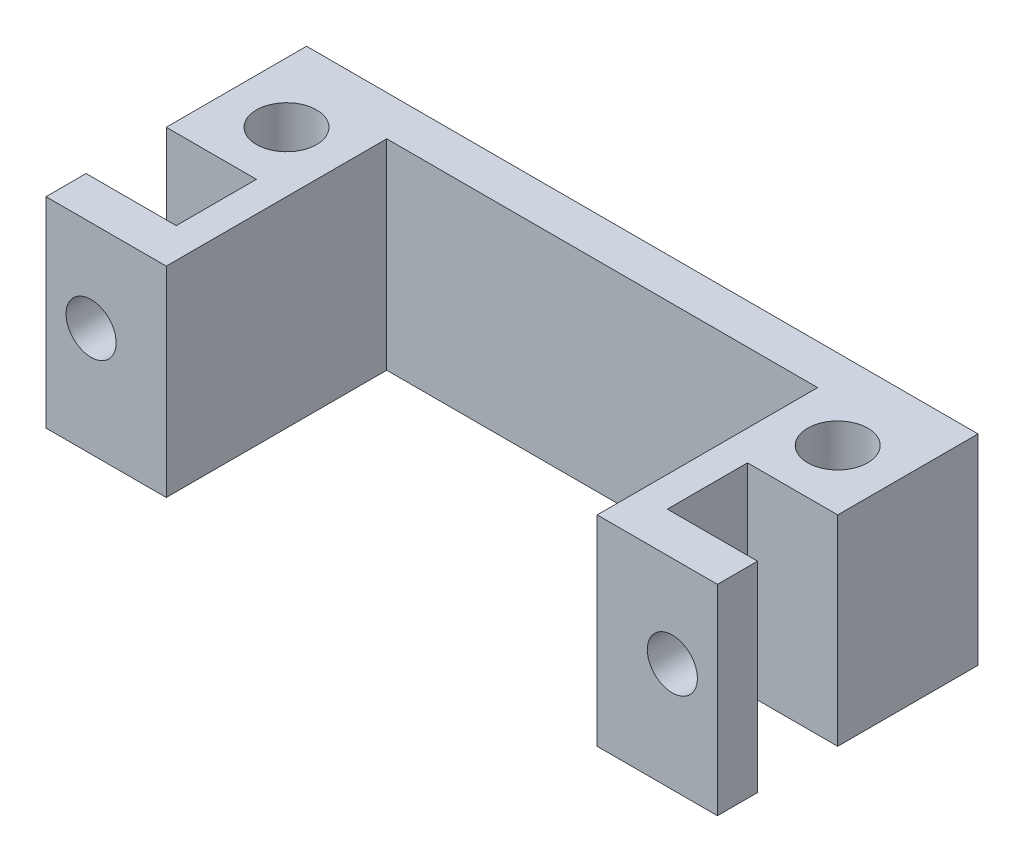
ISO-10303-21;
HEADER;
FILE_DESCRIPTION(('STEP AP214'),'2;1');
FILE_NAME('part.step','',(''),(''),'','','');
FILE_SCHEMA(('AUTOMOTIVE_DESIGN { 1 0 10303 214 1 1 1 1 }'));
ENDSEC;
DATA;
#1=APPLICATION_CONTEXT('core data for automotive mechanical design processes');
#2=APPLICATION_PROTOCOL_DEFINITION('international standard','automotive_design',2000,#1);
#3=PRODUCT_CONTEXT('',#1,'mechanical');
#4=PRODUCT('Part','Part','',(#3));
#5=PRODUCT_RELATED_PRODUCT_CATEGORY('part','',(#4));
#6=PRODUCT_DEFINITION_FORMATION('','',#4);
#7=PRODUCT_DEFINITION_CONTEXT('part definition',#1,'design');
#8=PRODUCT_DEFINITION('design','',#6,#7);
#9=PRODUCT_DEFINITION_SHAPE('','',#8);
#10=(LENGTH_UNIT() NAMED_UNIT(*) SI_UNIT(.MILLI.,.METRE.));
#11=(NAMED_UNIT(*) PLANE_ANGLE_UNIT() SI_UNIT($,.RADIAN.));
#12=(NAMED_UNIT(*) SI_UNIT($,.STERADIAN.) SOLID_ANGLE_UNIT());
#13=UNCERTAINTY_MEASURE_WITH_UNIT(LENGTH_MEASURE(1.E-05),#10,'distance_accuracy_value','');
#14=(GEOMETRIC_REPRESENTATION_CONTEXT(3) GLOBAL_UNCERTAINTY_ASSIGNED_CONTEXT((#13)) GLOBAL_UNIT_ASSIGNED_CONTEXT((#10,
#11,#12)) REPRESENTATION_CONTEXT('',''));
#15=CARTESIAN_POINT('',(0.,0.,0.));
#16=DIRECTION('',(0.,0.,1.));
#17=DIRECTION('',(1.,0.,0.));
#18=AXIS2_PLACEMENT_3D('',#15,#16,#17);
#19=CARTESIAN_POINT('',(0.,25.4,0.));
#20=DIRECTION('',(1.,0.,0.));
#21=DIRECTION('',(0.,0.,-1.));
#22=AXIS2_PLACEMENT_3D('',#19,#20,#21);
#23=PLANE('',#22);
#24=DIRECTION('',(0.,0.,1.));
#25=VECTOR('',#24,1.);
#26=CARTESIAN_POINT('',(0.,0.,0.));
#27=LINE('',#26,#25);
#28=CARTESIAN_POINT('',(0.,0.,-5.08));
#29=VERTEX_POINT('',#28);
#30=CARTESIAN_POINT('',(0.,0.,0.));
#31=VERTEX_POINT('',#30);
#32=EDGE_CURVE('E191',#29,#31,#27,.T.);
#33=ORIENTED_EDGE('',*,*,#32,.T.);
#34=DIRECTION('',(0.,-1.,0.));
#35=VECTOR('',#34,1.);
#36=CARTESIAN_POINT('',(0.,25.4,0.));
#37=LINE('',#36,#35);
#38=CARTESIAN_POINT('',(0.,25.4,0.));
#39=VERTEX_POINT('',#38);
#40=EDGE_CURVE('E11',#39,#31,#37,.T.);
#41=ORIENTED_EDGE('',*,*,#40,.F.);
#42=DIRECTION('',(0.,0.,1.));
#43=VECTOR('',#42,1.);
#44=CARTESIAN_POINT('',(0.,25.4,0.));
#45=LINE('',#44,#43);
#46=CARTESIAN_POINT('',(0.,25.4,-5.08));
#47=VERTEX_POINT('',#46);
#48=EDGE_CURVE('E222',#47,#39,#45,.T.);
#49=ORIENTED_EDGE('',*,*,#48,.F.);
#50=DIRECTION('',(0.,-1.,0.));
#51=VECTOR('',#50,1.);
#52=CARTESIAN_POINT('',(0.,25.4,-5.08));
#53=LINE('',#52,#51);
#54=EDGE_CURVE('E187',#47,#29,#53,.T.);
#55=ORIENTED_EDGE('',*,*,#54,.T.);
#56=EDGE_LOOP('',(#33,#41,#49,#55));
#57=FACE_BOUND('',#56,.T.);
#58=ADVANCED_FACE('F40',(#57),#23,.F.);
#59=CARTESIAN_POINT('',(0.,25.4,0.));
#60=DIRECTION('',(0.,0.,-1.));
#61=DIRECTION('',(-1.,0.,0.));
#62=AXIS2_PLACEMENT_3D('',#59,#60,#61);
#63=PLANE('',#62);
#64=CARTESIAN_POINT('',(5.71500000000001,13.8028224729058,0.));
#65=DIRECTION('',(0.,0.,1.));
#66=DIRECTION('',(1.,0.,0.));
#67=AXIS2_PLACEMENT_3D('',#64,#65,#66);
#68=CIRCLE('',#67,3.17499999999999);
#69=CARTESIAN_POINT('',(8.88999999999999,13.8028224729058,0.));
#70=VERTEX_POINT('',#69);
#71=EDGE_CURVE('E265',#70,#70,#68,.T.);
#72=ORIENTED_EDGE('',*,*,#71,.F.);
#73=EDGE_LOOP('',(#72));
#74=FACE_BOUND('',#73,.T.);
#75=DIRECTION('',(1.,0.,0.));
#76=VECTOR('',#75,1.);
#77=CARTESIAN_POINT('',(0.,0.,0.));
#78=LINE('',#77,#76);
#79=CARTESIAN_POINT('',(15.24,0.,0.));
#80=VERTEX_POINT('',#79);
#81=EDGE_CURVE('E194',#31,#80,#78,.T.);
#82=ORIENTED_EDGE('',*,*,#81,.T.);
#83=DIRECTION('',(0.,-1.,0.));
#84=VECTOR('',#83,1.);
#85=CARTESIAN_POINT('',(15.24,25.4,0.));
#86=LINE('',#85,#84);
#87=CARTESIAN_POINT('',(15.24,25.4,0.));
#88=VERTEX_POINT('',#87);
#89=EDGE_CURVE('E54',#88,#80,#86,.T.);
#90=ORIENTED_EDGE('',*,*,#89,.F.);
#91=DIRECTION('',(1.,0.,0.));
#92=VECTOR('',#91,1.);
#93=CARTESIAN_POINT('',(0.,25.4,0.));
#94=LINE('',#93,#92);
#95=EDGE_CURVE('E130',#39,#88,#94,.T.);
#96=ORIENTED_EDGE('',*,*,#95,.F.);
#97=ORIENTED_EDGE('',*,*,#40,.T.);
#98=EDGE_LOOP('',(#82,#90,#96,#97));
#99=FACE_BOUND('',#98,.T.);
#100=ADVANCED_FACE('F298',(#74,#99),#63,.F.);
#101=CARTESIAN_POINT('',(15.24,25.4,0.));
#102=DIRECTION('',(-1.,0.,0.));
#103=DIRECTION('',(0.,0.,1.));
#104=AXIS2_PLACEMENT_3D('',#101,#102,#103);
#105=PLANE('',#104);
#106=DIRECTION('',(0.,0.,-1.));
#107=VECTOR('',#106,1.);
#108=CARTESIAN_POINT('',(15.24,0.,0.));
#109=LINE('',#108,#107);
#110=CARTESIAN_POINT('',(15.24,0.,-27.94));
#111=VERTEX_POINT('',#110);
#112=EDGE_CURVE('E197',#80,#111,#109,.T.);
#113=ORIENTED_EDGE('',*,*,#112,.T.);
#114=DIRECTION('',(0.,-1.,0.));
#115=VECTOR('',#114,1.);
#116=CARTESIAN_POINT('',(15.24,25.4,-27.94));
#117=LINE('',#116,#115);
#118=CARTESIAN_POINT('',(15.24,25.4,-27.94));
#119=VERTEX_POINT('',#118);
#120=EDGE_CURVE('E253',#119,#111,#117,.T.);
#121=ORIENTED_EDGE('',*,*,#120,.F.);
#122=DIRECTION('',(0.,0.,-1.));
#123=VECTOR('',#122,1.);
#124=CARTESIAN_POINT('',(15.24,25.4,0.));
#125=LINE('',#124,#123);
#126=EDGE_CURVE('E315',#88,#119,#125,.T.);
#127=ORIENTED_EDGE('',*,*,#126,.F.);
#128=ORIENTED_EDGE('',*,*,#89,.T.);
#129=EDGE_LOOP('',(#113,#121,#127,#128));
#130=FACE_BOUND('',#129,.T.);
#131=ADVANCED_FACE('F303',(#130),#105,.F.);
#132=CARTESIAN_POINT('',(15.24,25.4,-27.94));
#133=DIRECTION('',(0.,0.,-1.));
#134=DIRECTION('',(-1.,0.,0.));
#135=AXIS2_PLACEMENT_3D('',#132,#133,#134);
#136=PLANE('',#135);
#137=DIRECTION('',(1.,0.,0.));
#138=VECTOR('',#137,1.);
#139=CARTESIAN_POINT('',(15.24,0.,-27.94));
#140=LINE('',#139,#138);
#141=CARTESIAN_POINT('',(69.85,0.,-27.94));
#142=VERTEX_POINT('',#141);
#143=EDGE_CURVE('E199',#111,#142,#140,.T.);
#144=ORIENTED_EDGE('',*,*,#143,.T.);
#145=DIRECTION('',(0.,-1.,0.));
#146=VECTOR('',#145,1.);
#147=CARTESIAN_POINT('',(69.85,25.4,-27.94));
#148=LINE('',#147,#146);
#149=CARTESIAN_POINT('',(69.85,25.4,-27.94));
#150=VERTEX_POINT('',#149);
#151=EDGE_CURVE('E250',#150,#142,#148,.T.);
#152=ORIENTED_EDGE('',*,*,#151,.F.);
#153=DIRECTION('',(1.,0.,0.));
#154=VECTOR('',#153,1.);
#155=CARTESIAN_POINT('',(15.24,25.4,-27.94));
#156=LINE('',#155,#154);
#157=EDGE_CURVE('E317',#119,#150,#156,.T.);
#158=ORIENTED_EDGE('',*,*,#157,.F.);
#159=ORIENTED_EDGE('',*,*,#120,.T.);
#160=EDGE_LOOP('',(#144,#152,#158,#159));
#161=FACE_BOUND('',#160,.T.);
#162=ADVANCED_FACE('F383',(#161),#136,.F.);
#163=CARTESIAN_POINT('',(69.85,25.4,0.));
#164=DIRECTION('',(1.,0.,0.));
#165=DIRECTION('',(0.,0.,-1.));
#166=AXIS2_PLACEMENT_3D('',#163,#164,#165);
#167=PLANE('',#166);
#168=DIRECTION('',(0.,0.,1.));
#169=VECTOR('',#168,1.);
#170=CARTESIAN_POINT('',(69.85,0.,0.));
#171=LINE('',#170,#169);
#172=CARTESIAN_POINT('',(69.85,0.,0.));
#173=VERTEX_POINT('',#172);
#174=EDGE_CURVE('E201',#142,#173,#171,.T.);
#175=ORIENTED_EDGE('',*,*,#174,.T.);
#176=DIRECTION('',(0.,-1.,0.));
#177=VECTOR('',#176,1.);
#178=CARTESIAN_POINT('',(69.85,25.4,0.));
#179=LINE('',#178,#177);
#180=CARTESIAN_POINT('',(69.85,25.4,0.));
#181=VERTEX_POINT('',#180);
#182=EDGE_CURVE('E247',#181,#173,#179,.T.);
#183=ORIENTED_EDGE('',*,*,#182,.F.);
#184=DIRECTION('',(0.,0.,1.));
#185=VECTOR('',#184,1.);
#186=CARTESIAN_POINT('',(69.85,25.4,0.));
#187=LINE('',#186,#185);
#188=EDGE_CURVE('E319',#150,#181,#187,.T.);
#189=ORIENTED_EDGE('',*,*,#188,.F.);
#190=ORIENTED_EDGE('',*,*,#151,.T.);
#191=EDGE_LOOP('',(#175,#183,#189,#190));
#192=FACE_BOUND('',#191,.T.);
#193=ADVANCED_FACE('F379',(#192),#167,.F.);
#194=CARTESIAN_POINT('',(69.85,25.4,0.));
#195=DIRECTION('',(0.,0.,-1.));
#196=DIRECTION('',(-1.,0.,0.));
#197=AXIS2_PLACEMENT_3D('',#194,#195,#196);
#198=PLANE('',#197);
#199=CARTESIAN_POINT('',(79.375,13.8028224729058,0.));
#200=DIRECTION('',(0.,0.,1.));
#201=DIRECTION('',(1.,0.,0.));
#202=AXIS2_PLACEMENT_3D('',#199,#200,#201);
#203=CIRCLE('',#202,3.17499999999998);
#204=CARTESIAN_POINT('',(82.55,13.8028224729058,0.));
#205=VERTEX_POINT('',#204);
#206=EDGE_CURVE('E262',#205,#205,#203,.T.);
#207=ORIENTED_EDGE('',*,*,#206,.F.);
#208=EDGE_LOOP('',(#207));
#209=FACE_BOUND('',#208,.T.);
#210=DIRECTION('',(1.,0.,0.));
#211=VECTOR('',#210,1.);
#212=CARTESIAN_POINT('',(69.85,0.,0.));
#213=LINE('',#212,#211);
#214=CARTESIAN_POINT('',(85.09,0.,0.));
#215=VERTEX_POINT('',#214);
#216=EDGE_CURVE('E203',#173,#215,#213,.T.);
#217=ORIENTED_EDGE('',*,*,#216,.T.);
#218=DIRECTION('',(0.,-1.,0.));
#219=VECTOR('',#218,1.);
#220=CARTESIAN_POINT('',(85.09,25.4,0.));
#221=LINE('',#220,#219);
#222=CARTESIAN_POINT('',(85.09,25.4,0.));
#223=VERTEX_POINT('',#222);
#224=EDGE_CURVE('E244',#223,#215,#221,.T.);
#225=ORIENTED_EDGE('',*,*,#224,.F.);
#226=DIRECTION('',(1.,0.,0.));
#227=VECTOR('',#226,1.);
#228=CARTESIAN_POINT('',(69.85,25.4,0.));
#229=LINE('',#228,#227);
#230=EDGE_CURVE('E325',#181,#223,#229,.T.);
#231=ORIENTED_EDGE('',*,*,#230,.F.);
#232=ORIENTED_EDGE('',*,*,#182,.T.);
#233=EDGE_LOOP('',(#217,#225,#231,#232));
#234=FACE_BOUND('',#233,.T.);
#235=ADVANCED_FACE('F375',(#209,#234),#198,.F.);
#236=CARTESIAN_POINT('',(85.09,25.4,0.));
#237=DIRECTION('',(-1.,0.,0.));
#238=DIRECTION('',(0.,0.,1.));
#239=AXIS2_PLACEMENT_3D('',#236,#237,#238);
#240=PLANE('',#239);
#241=DIRECTION('',(0.,0.,-1.));
#242=VECTOR('',#241,1.);
#243=CARTESIAN_POINT('',(85.09,0.,0.));
#244=LINE('',#243,#242);
#245=CARTESIAN_POINT('',(85.09,0.,-5.08000000000001));
#246=VERTEX_POINT('',#245);
#247=EDGE_CURVE('E205',#215,#246,#244,.T.);
#248=ORIENTED_EDGE('',*,*,#247,.T.);
#249=DIRECTION('',(0.,-1.,0.));
#250=VECTOR('',#249,1.);
#251=CARTESIAN_POINT('',(85.09,25.4,-5.08000000000001));
#252=LINE('',#251,#250);
#253=CARTESIAN_POINT('',(85.09,25.4,-5.08000000000001));
#254=VERTEX_POINT('',#253);
#255=EDGE_CURVE('E241',#254,#246,#252,.T.);
#256=ORIENTED_EDGE('',*,*,#255,.F.);
#257=DIRECTION('',(0.,0.,-1.));
#258=VECTOR('',#257,1.);
#259=CARTESIAN_POINT('',(85.09,25.4,0.));
#260=LINE('',#259,#258);
#261=EDGE_CURVE('E327',#223,#254,#260,.T.);
#262=ORIENTED_EDGE('',*,*,#261,.F.);
#263=ORIENTED_EDGE('',*,*,#224,.T.);
#264=EDGE_LOOP('',(#248,#256,#262,#263));
#265=FACE_BOUND('',#264,.T.);
#266=ADVANCED_FACE('F371',(#265),#240,.F.);
#267=CARTESIAN_POINT('',(73.66,25.4,-5.08000000000001));
#268=DIRECTION('',(0.,0.,1.));
#269=DIRECTION('',(1.,0.,0.));
#270=AXIS2_PLACEMENT_3D('',#267,#268,#269);
#271=PLANE('',#270);
#272=CARTESIAN_POINT('',(79.375,13.8028224729058,-5.08000000000001));
#273=DIRECTION('',(0.,0.,1.));
#274=DIRECTION('',(1.,0.,0.));
#275=AXIS2_PLACEMENT_3D('',#272,#273,#274);
#276=CIRCLE('',#275,3.17499999999999);
#277=CARTESIAN_POINT('',(82.55,13.8028224729058,-5.08000000000001));
#278=VERTEX_POINT('',#277);
#279=EDGE_CURVE('E258',#278,#278,#276,.T.);
#280=ORIENTED_EDGE('',*,*,#279,.T.);
#281=EDGE_LOOP('',(#280));
#282=FACE_BOUND('',#281,.T.);
#283=DIRECTION('',(-1.,0.,0.));
#284=VECTOR('',#283,1.);
#285=CARTESIAN_POINT('',(73.66,0.,-5.08000000000001));
#286=LINE('',#285,#284);
#287=CARTESIAN_POINT('',(73.66,0.,-5.08000000000001));
#288=VERTEX_POINT('',#287);
#289=EDGE_CURVE('E207',#246,#288,#286,.T.);
#290=ORIENTED_EDGE('',*,*,#289,.T.);
#291=DIRECTION('',(0.,-1.,0.));
#292=VECTOR('',#291,1.);
#293=CARTESIAN_POINT('',(73.66,25.4,-5.08000000000001));
#294=LINE('',#293,#292);
#295=CARTESIAN_POINT('',(73.66,25.4,-5.08000000000001));
#296=VERTEX_POINT('',#295);
#297=EDGE_CURVE('E238',#296,#288,#294,.T.);
#298=ORIENTED_EDGE('',*,*,#297,.F.);
#299=DIRECTION('',(-1.,0.,0.));
#300=VECTOR('',#299,1.);
#301=CARTESIAN_POINT('',(73.66,25.4,-5.08000000000001));
#302=LINE('',#301,#300);
#303=EDGE_CURVE('E329',#254,#296,#302,.T.);
#304=ORIENTED_EDGE('',*,*,#303,.F.);
#305=ORIENTED_EDGE('',*,*,#255,.T.);
#306=EDGE_LOOP('',(#290,#298,#304,#305));
#307=FACE_BOUND('',#306,.T.);
#308=ADVANCED_FACE('F366',(#282,#307),#271,.F.);
#309=CARTESIAN_POINT('',(73.66,25.4,-15.24));
#310=DIRECTION('',(-1.,0.,0.));
#311=DIRECTION('',(0.,0.,1.));
#312=AXIS2_PLACEMENT_3D('',#309,#310,#311);
#313=PLANE('',#312);
#314=DIRECTION('',(0.,0.,-1.));
#315=VECTOR('',#314,1.);
#316=CARTESIAN_POINT('',(73.66,0.,-15.24));
#317=LINE('',#316,#315);
#318=CARTESIAN_POINT('',(73.66,0.,-15.24));
#319=VERTEX_POINT('',#318);
#320=EDGE_CURVE('E209',#288,#319,#317,.T.);
#321=ORIENTED_EDGE('',*,*,#320,.T.);
#322=DIRECTION('',(0.,-1.,0.));
#323=VECTOR('',#322,1.);
#324=CARTESIAN_POINT('',(73.66,25.4,-15.24));
#325=LINE('',#324,#323);
#326=CARTESIAN_POINT('',(73.66,25.4,-15.24));
#327=VERTEX_POINT('',#326);
#328=EDGE_CURVE('E235',#327,#319,#325,.T.);
#329=ORIENTED_EDGE('',*,*,#328,.F.);
#330=DIRECTION('',(0.,0.,-1.));
#331=VECTOR('',#330,1.);
#332=CARTESIAN_POINT('',(73.66,25.4,-15.24));
#333=LINE('',#332,#331);
#334=EDGE_CURVE('E331',#296,#327,#333,.T.);
#335=ORIENTED_EDGE('',*,*,#334,.F.);
#336=ORIENTED_EDGE('',*,*,#297,.T.);
#337=EDGE_LOOP('',(#321,#329,#335,#336));
#338=FACE_BOUND('',#337,.T.);
#339=ADVANCED_FACE('F360',(#338),#313,.F.);
#340=CARTESIAN_POINT('',(85.09,25.4,-15.24));
#341=DIRECTION('',(0.,0.,-1.));
#342=DIRECTION('',(-1.,0.,0.));
#343=AXIS2_PLACEMENT_3D('',#340,#341,#342);
#344=PLANE('',#343);
#345=DIRECTION('',(1.,0.,0.));
#346=VECTOR('',#345,1.);
#347=CARTESIAN_POINT('',(85.09,0.,-15.24));
#348=LINE('',#347,#346);
#349=CARTESIAN_POINT('',(85.09,0.,-15.24));
#350=VERTEX_POINT('',#349);
#351=EDGE_CURVE('E211',#319,#350,#348,.T.);
#352=ORIENTED_EDGE('',*,*,#351,.T.);
#353=DIRECTION('',(0.,-1.,0.));
#354=VECTOR('',#353,1.);
#355=CARTESIAN_POINT('',(85.09,25.4,-15.24));
#356=LINE('',#355,#354);
#357=CARTESIAN_POINT('',(85.09,25.4,-15.24));
#358=VERTEX_POINT('',#357);
#359=EDGE_CURVE('E232',#358,#350,#356,.T.);
#360=ORIENTED_EDGE('',*,*,#359,.F.);
#361=DIRECTION('',(1.,0.,0.));
#362=VECTOR('',#361,1.);
#363=CARTESIAN_POINT('',(85.09,25.4,-15.24));
#364=LINE('',#363,#362);
#365=EDGE_CURVE('E333',#327,#358,#364,.T.);
#366=ORIENTED_EDGE('',*,*,#365,.F.);
#367=ORIENTED_EDGE('',*,*,#328,.T.);
#368=EDGE_LOOP('',(#352,#360,#366,#367));
#369=FACE_BOUND('',#368,.T.);
#370=ADVANCED_FACE('F356',(#369),#344,.F.);
#371=CARTESIAN_POINT('',(85.09,25.4,-15.24));
#372=DIRECTION('',(-1.,0.,0.));
#373=DIRECTION('',(0.,0.,1.));
#374=AXIS2_PLACEMENT_3D('',#371,#372,#373);
#375=PLANE('',#374);
#376=DIRECTION('',(0.,0.,-1.));
#377=VECTOR('',#376,1.);
#378=CARTESIAN_POINT('',(85.09,0.,-15.24));
#379=LINE('',#378,#377);
#380=CARTESIAN_POINT('',(85.09,0.,-33.02));
#381=VERTEX_POINT('',#380);
#382=EDGE_CURVE('E213',#350,#381,#379,.T.);
#383=ORIENTED_EDGE('',*,*,#382,.T.);
#384=DIRECTION('',(0.,-1.,0.));
#385=VECTOR('',#384,1.);
#386=CARTESIAN_POINT('',(85.09,25.4,-33.02));
#387=LINE('',#386,#385);
#388=CARTESIAN_POINT('',(85.09,25.4,-33.02));
#389=VERTEX_POINT('',#388);
#390=EDGE_CURVE('E229',#389,#381,#387,.T.);
#391=ORIENTED_EDGE('',*,*,#390,.F.);
#392=DIRECTION('',(0.,0.,-1.));
#393=VECTOR('',#392,1.);
#394=CARTESIAN_POINT('',(85.09,25.4,-15.24));
#395=LINE('',#394,#393);
#396=EDGE_CURVE('E335',#358,#389,#395,.T.);
#397=ORIENTED_EDGE('',*,*,#396,.F.);
#398=ORIENTED_EDGE('',*,*,#359,.T.);
#399=EDGE_LOOP('',(#383,#391,#397,#398));
#400=FACE_BOUND('',#399,.T.);
#401=ADVANCED_FACE('F352',(#400),#375,.F.);
#402=CARTESIAN_POINT('',(0.,25.4,-33.02));
#403=DIRECTION('',(0.,0.,1.));
#404=DIRECTION('',(1.,0.,0.));
#405=AXIS2_PLACEMENT_3D('',#402,#403,#404);
#406=PLANE('',#405);
#407=CARTESIAN_POINT('',(77.47,12.7,-33.02));
#408=DIRECTION('',(0.,0.,-1.));
#409=DIRECTION('',(-1.,0.,0.));
#410=AXIS2_PLACEMENT_3D('',#407,#408,#409);
#411=CIRCLE('',#410,3.17499999999998);
#412=CARTESIAN_POINT('',(74.295,12.7,-33.02));
#413=VERTEX_POINT('',#412);
#414=EDGE_CURVE('E453',#413,#413,#411,.T.);
#415=ORIENTED_EDGE('',*,*,#414,.F.);
#416=EDGE_LOOP('',(#415));
#417=FACE_BOUND('',#416,.T.);
#418=CARTESIAN_POINT('',(7.62,12.7,-33.02));
#419=DIRECTION('',(0.,0.,-1.));
#420=DIRECTION('',(-1.,0.,0.));
#421=AXIS2_PLACEMENT_3D('',#418,#419,#420);
#422=CIRCLE('',#421,3.17499999999999);
#423=CARTESIAN_POINT('',(4.44500000000001,12.7,-33.02));
#424=VERTEX_POINT('',#423);
#425=EDGE_CURVE('E273',#424,#424,#422,.T.);
#426=ORIENTED_EDGE('',*,*,#425,.F.);
#427=EDGE_LOOP('',(#426));
#428=FACE_BOUND('',#427,.T.);
#429=DIRECTION('',(-1.,0.,0.));
#430=VECTOR('',#429,1.);
#431=CARTESIAN_POINT('',(0.,0.,-33.02));
#432=LINE('',#431,#430);
#433=CARTESIAN_POINT('',(0.,0.,-33.02));
#434=VERTEX_POINT('',#433);
#435=EDGE_CURVE('E215',#381,#434,#432,.T.);
#436=ORIENTED_EDGE('',*,*,#435,.T.);
#437=DIRECTION('',(0.,-1.,0.));
#438=VECTOR('',#437,1.);
#439=CARTESIAN_POINT('',(0.,25.4,-33.02));
#440=LINE('',#439,#438);
#441=CARTESIAN_POINT('',(0.,25.4,-33.02));
#442=VERTEX_POINT('',#441);
#443=EDGE_CURVE('E226',#442,#434,#440,.T.);
#444=ORIENTED_EDGE('',*,*,#443,.F.);
#445=DIRECTION('',(-1.,0.,0.));
#446=VECTOR('',#445,1.);
#447=CARTESIAN_POINT('',(0.,25.4,-33.02));
#448=LINE('',#447,#446);
#449=EDGE_CURVE('E337',#389,#442,#448,.T.);
#450=ORIENTED_EDGE('',*,*,#449,.F.);
#451=ORIENTED_EDGE('',*,*,#390,.T.);
#452=EDGE_LOOP('',(#436,#444,#450,#451));
#453=FACE_BOUND('',#452,.T.);
#454=ADVANCED_FACE('F343',(#417,#428,#453),#406,.F.);
#455=CARTESIAN_POINT('',(0.,25.4,-15.24));
#456=DIRECTION('',(1.,0.,0.));
#457=DIRECTION('',(0.,0.,-1.));
#458=AXIS2_PLACEMENT_3D('',#455,#456,#457);
#459=PLANE('',#458);
#460=DIRECTION('',(0.,0.,1.));
#461=VECTOR('',#460,1.);
#462=CARTESIAN_POINT('',(0.,0.,-15.24));
#463=LINE('',#462,#461);
#464=CARTESIAN_POINT('',(0.,0.,-15.24));
#465=VERTEX_POINT('',#464);
#466=EDGE_CURVE('E217',#434,#465,#463,.T.);
#467=ORIENTED_EDGE('',*,*,#466,.T.);
#468=DIRECTION('',(0.,-1.,0.));
#469=VECTOR('',#468,1.);
#470=CARTESIAN_POINT('',(0.,25.4,-15.24));
#471=LINE('',#470,#469);
#472=CARTESIAN_POINT('',(0.,25.4,-15.24));
#473=VERTEX_POINT('',#472);
#474=EDGE_CURVE('E182',#473,#465,#471,.T.);
#475=ORIENTED_EDGE('',*,*,#474,.F.);
#476=DIRECTION('',(0.,0.,1.));
#477=VECTOR('',#476,1.);
#478=CARTESIAN_POINT('',(0.,25.4,-15.24));
#479=LINE('',#478,#477);
#480=EDGE_CURVE('E173',#442,#473,#479,.T.);
#481=ORIENTED_EDGE('',*,*,#480,.F.);
#482=ORIENTED_EDGE('',*,*,#443,.T.);
#483=EDGE_LOOP('',(#467,#475,#481,#482));
#484=FACE_BOUND('',#483,.T.);
#485=ADVANCED_FACE('F347',(#484),#459,.F.);
#486=CARTESIAN_POINT('',(0.,25.4,-15.24));
#487=DIRECTION('',(0.,0.,-1.));
#488=DIRECTION('',(-1.,0.,0.));
#489=AXIS2_PLACEMENT_3D('',#486,#487,#488);
#490=PLANE('',#489);
#491=DIRECTION('',(1.,0.,0.));
#492=VECTOR('',#491,1.);
#493=CARTESIAN_POINT('',(0.,0.,-15.24));
#494=LINE('',#493,#492);
#495=CARTESIAN_POINT('',(11.43,0.,-15.24));
#496=VERTEX_POINT('',#495);
#497=EDGE_CURVE('E181',#465,#496,#494,.T.);
#498=ORIENTED_EDGE('',*,*,#497,.T.);
#499=DIRECTION('',(0.,-1.,0.));
#500=VECTOR('',#499,1.);
#501=CARTESIAN_POINT('',(11.43,25.4,-15.24));
#502=LINE('',#501,#500);
#503=CARTESIAN_POINT('',(11.43,25.4,-15.24));
#504=VERTEX_POINT('',#503);
#505=EDGE_CURVE('E178',#504,#496,#502,.T.);
#506=ORIENTED_EDGE('',*,*,#505,.F.);
#507=DIRECTION('',(1.,0.,0.));
#508=VECTOR('',#507,1.);
#509=CARTESIAN_POINT('',(0.,25.4,-15.24));
#510=LINE('',#509,#508);
#511=EDGE_CURVE('E167',#473,#504,#510,.T.);
#512=ORIENTED_EDGE('',*,*,#511,.F.);
#513=ORIENTED_EDGE('',*,*,#474,.T.);
#514=EDGE_LOOP('',(#498,#506,#512,#513));
#515=FACE_BOUND('',#514,.T.);
#516=ADVANCED_FACE('F179',(#515),#490,.F.);
#517=CARTESIAN_POINT('',(11.43,25.4,-15.24));
#518=DIRECTION('',(1.,0.,0.));
#519=DIRECTION('',(0.,0.,-1.));
#520=AXIS2_PLACEMENT_3D('',#517,#518,#519);
#521=PLANE('',#520);
#522=DIRECTION('',(0.,0.,1.));
#523=VECTOR('',#522,1.);
#524=CARTESIAN_POINT('',(11.43,0.,-15.24));
#525=LINE('',#524,#523);
#526=CARTESIAN_POINT('',(11.43,0.,-5.08));
#527=VERTEX_POINT('',#526);
#528=EDGE_CURVE('E116',#496,#527,#525,.T.);
#529=ORIENTED_EDGE('',*,*,#528,.T.);
#530=DIRECTION('',(0.,-1.,0.));
#531=VECTOR('',#530,1.);
#532=CARTESIAN_POINT('',(11.43,25.4,-5.08));
#533=LINE('',#532,#531);
#534=CARTESIAN_POINT('',(11.43,25.4,-5.08));
#535=VERTEX_POINT('',#534);
#536=EDGE_CURVE('E183',#535,#527,#533,.T.);
#537=ORIENTED_EDGE('',*,*,#536,.F.);
#538=DIRECTION('',(0.,0.,1.));
#539=VECTOR('',#538,1.);
#540=CARTESIAN_POINT('',(11.43,25.4,-15.24));
#541=LINE('',#540,#539);
#542=EDGE_CURVE('E171',#504,#535,#541,.T.);
#543=ORIENTED_EDGE('',*,*,#542,.F.);
#544=ORIENTED_EDGE('',*,*,#505,.T.);
#545=EDGE_LOOP('',(#529,#537,#543,#544));
#546=FACE_BOUND('',#545,.T.);
#547=ADVANCED_FACE('F185',(#546),#521,.F.);
#548=CARTESIAN_POINT('',(11.43,25.4,-5.08));
#549=DIRECTION('',(0.,0.,1.));
#550=DIRECTION('',(1.,0.,0.));
#551=AXIS2_PLACEMENT_3D('',#548,#549,#550);
#552=PLANE('',#551);
#553=CARTESIAN_POINT('',(5.71500000000001,13.8028224729058,-5.08));
#554=DIRECTION('',(0.,0.,1.));
#555=DIRECTION('',(1.,0.,0.));
#556=AXIS2_PLACEMENT_3D('',#553,#554,#555);
#557=CIRCLE('',#556,3.17499999999999);
#558=CARTESIAN_POINT('',(8.89,13.8028224729058,-5.08));
#559=VERTEX_POINT('',#558);
#560=EDGE_CURVE('E263',#559,#559,#557,.T.);
#561=ORIENTED_EDGE('',*,*,#560,.T.);
#562=EDGE_LOOP('',(#561));
#563=FACE_BOUND('',#562,.T.);
#564=DIRECTION('',(-1.,0.,0.));
#565=VECTOR('',#564,1.);
#566=CARTESIAN_POINT('',(11.43,0.,-5.08));
#567=LINE('',#566,#565);
#568=EDGE_CURVE('E122',#527,#29,#567,.T.);
#569=ORIENTED_EDGE('',*,*,#568,.T.);
#570=ORIENTED_EDGE('',*,*,#54,.F.);
#571=DIRECTION('',(-1.,0.,0.));
#572=VECTOR('',#571,1.);
#573=CARTESIAN_POINT('',(11.43,25.4,-5.08));
#574=LINE('',#573,#572);
#575=EDGE_CURVE('E63',#535,#47,#574,.T.);
#576=ORIENTED_EDGE('',*,*,#575,.F.);
#577=ORIENTED_EDGE('',*,*,#536,.T.);
#578=EDGE_LOOP('',(#569,#570,#576,#577));
#579=FACE_BOUND('',#578,.T.);
#580=ADVANCED_FACE('F416',(#563,#579),#552,.F.);
#581=CARTESIAN_POINT('',(0.,25.4,0.));
#582=DIRECTION('',(0.,1.,0.));
#583=DIRECTION('',(0.,0.,1.));
#584=AXIS2_PLACEMENT_3D('',#581,#582,#583);
#585=PLANE('',#584);
#586=CARTESIAN_POINT('',(7.62,25.4,-22.86));
#587=DIRECTION('',(0.,1.,0.));
#588=DIRECTION('',(0.,0.,1.));
#589=AXIS2_PLACEMENT_3D('',#586,#587,#588);
#590=CIRCLE('',#589,3.81);
#591=CARTESIAN_POINT('',(7.62,25.4,-19.05));
#592=VERTEX_POINT('',#591);
#593=EDGE_CURVE('E440',#592,#592,#590,.T.);
#594=ORIENTED_EDGE('',*,*,#593,.F.);
#595=EDGE_LOOP('',(#594));
#596=FACE_BOUND('',#595,.T.);
#597=CARTESIAN_POINT('',(77.47,25.4,-22.86));
#598=DIRECTION('',(0.,1.,0.));
#599=DIRECTION('',(0.,0.,1.));
#600=AXIS2_PLACEMENT_3D('',#597,#598,#599);
#601=CIRCLE('',#600,3.81);
#602=CARTESIAN_POINT('',(77.47,25.4,-19.05));
#603=VERTEX_POINT('',#602);
#604=EDGE_CURVE('E438',#603,#603,#601,.T.);
#605=ORIENTED_EDGE('',*,*,#604,.F.);
#606=EDGE_LOOP('',(#605));
#607=FACE_BOUND('',#606,.T.);
#608=ORIENTED_EDGE('',*,*,#48,.T.);
#609=ORIENTED_EDGE('',*,*,#95,.T.);
#610=ORIENTED_EDGE('',*,*,#126,.T.);
#611=ORIENTED_EDGE('',*,*,#157,.T.);
#612=ORIENTED_EDGE('',*,*,#188,.T.);
#613=ORIENTED_EDGE('',*,*,#230,.T.);
#614=ORIENTED_EDGE('',*,*,#261,.T.);
#615=ORIENTED_EDGE('',*,*,#303,.T.);
#616=ORIENTED_EDGE('',*,*,#334,.T.);
#617=ORIENTED_EDGE('',*,*,#365,.T.);
#618=ORIENTED_EDGE('',*,*,#396,.T.);
#619=ORIENTED_EDGE('',*,*,#449,.T.);
#620=ORIENTED_EDGE('',*,*,#480,.T.);
#621=ORIENTED_EDGE('',*,*,#511,.T.);
#622=ORIENTED_EDGE('',*,*,#542,.T.);
#623=ORIENTED_EDGE('',*,*,#575,.T.);
#624=EDGE_LOOP('',(#608,#609,#610,#611,#612,#613,#614,#615,#616,#617,#618,#619,#620,#621,#622,#623));
#625=FACE_BOUND('',#624,.T.);
#626=ADVANCED_FACE('F169',(#596,#607,#625),#585,.T.);
#627=CARTESIAN_POINT('',(0.,0.,0.));
#628=DIRECTION('',(0.,1.,0.));
#629=DIRECTION('',(0.,0.,1.));
#630=AXIS2_PLACEMENT_3D('',#627,#628,#629);
#631=PLANE('',#630);
#632=CARTESIAN_POINT('',(7.62,0.,-22.86));
#633=DIRECTION('',(0.,1.,0.));
#634=DIRECTION('',(0.,0.,1.));
#635=AXIS2_PLACEMENT_3D('',#632,#633,#634);
#636=CIRCLE('',#635,3.81);
#637=CARTESIAN_POINT('',(7.62,0.,-19.05));
#638=VERTEX_POINT('',#637);
#639=EDGE_CURVE('E195',#638,#638,#636,.T.);
#640=ORIENTED_EDGE('',*,*,#639,.T.);
#641=EDGE_LOOP('',(#640));
#642=FACE_BOUND('',#641,.T.);
#643=CARTESIAN_POINT('',(77.47,0.,-22.86));
#644=DIRECTION('',(0.,1.,0.));
#645=DIRECTION('',(0.,0.,1.));
#646=AXIS2_PLACEMENT_3D('',#643,#644,#645);
#647=CIRCLE('',#646,3.81);
#648=CARTESIAN_POINT('',(77.47,0.,-19.05));
#649=VERTEX_POINT('',#648);
#650=EDGE_CURVE('E261',#649,#649,#647,.T.);
#651=ORIENTED_EDGE('',*,*,#650,.T.);
#652=EDGE_LOOP('',(#651));
#653=FACE_BOUND('',#652,.T.);
#654=ORIENTED_EDGE('',*,*,#32,.F.);
#655=ORIENTED_EDGE('',*,*,#568,.F.);
#656=ORIENTED_EDGE('',*,*,#528,.F.);
#657=ORIENTED_EDGE('',*,*,#497,.F.);
#658=ORIENTED_EDGE('',*,*,#466,.F.);
#659=ORIENTED_EDGE('',*,*,#435,.F.);
#660=ORIENTED_EDGE('',*,*,#382,.F.);
#661=ORIENTED_EDGE('',*,*,#351,.F.);
#662=ORIENTED_EDGE('',*,*,#320,.F.);
#663=ORIENTED_EDGE('',*,*,#289,.F.);
#664=ORIENTED_EDGE('',*,*,#247,.F.);
#665=ORIENTED_EDGE('',*,*,#216,.F.);
#666=ORIENTED_EDGE('',*,*,#174,.F.);
#667=ORIENTED_EDGE('',*,*,#143,.F.);
#668=ORIENTED_EDGE('',*,*,#112,.F.);
#669=ORIENTED_EDGE('',*,*,#81,.F.);
#670=EDGE_LOOP('',(#654,#655,#656,#657,#658,#659,#660,#661,#662,#663,#664,#665,#666,#667,#668,#669));
#671=FACE_BOUND('',#670,.T.);
#672=ADVANCED_FACE('F309',(#642,#653,#671),#631,.F.);
#673=CARTESIAN_POINT('',(77.47,0.,-22.86));
#674=DIRECTION('',(0.,1.,0.));
#675=DIRECTION('',(0.,0.,1.));
#676=AXIS2_PLACEMENT_3D('',#673,#674,#675);
#677=CYLINDRICAL_SURFACE('',#676,3.81);
#678=CARTESIAN_POINT('',(74.295,12.7,-24.9660567418757));
#679=CARTESIAN_POINT('',(74.2950078634035,12.8121464927487,-24.9660771581139));
#680=CARTESIAN_POINT('',(74.3010163945476,12.924484854066,-24.975211735744));
#681=CARTESIAN_POINT('',(74.3244260527369,13.1454879869782,-25.0098512916166));
#682=CARTESIAN_POINT('',(74.3418663277761,13.2541387808664,-25.0354125169818));
#683=CARTESIAN_POINT('',(74.3954967589072,13.5065834818376,-25.1108604746929));
#684=CARTESIAN_POINT('',(74.4363356926894,13.6476622900644,-25.166336857214));
#685=CARTESIAN_POINT('',(74.5344325522171,13.9181569418098,-25.2899773542362));
#686=CARTESIAN_POINT('',(74.5917436049132,14.0475332374249,-25.3581822679139));
#687=CARTESIAN_POINT('',(74.7033355095985,14.2608848913405,-25.4804061389393));
#688=CARTESIAN_POINT('',(74.7540615192208,14.3475123327229,-25.5331239502673));
#689=CARTESIAN_POINT('',(74.8631486034087,14.5152045100638,-25.639610036308));
#690=CARTESIAN_POINT('',(74.9215129584296,14.5962668330242,-25.6933787538668));
#691=CARTESIAN_POINT('',(75.0457153798117,14.7526623924208,-25.8003498508089));
#692=CARTESIAN_POINT('',(75.1115446715433,14.8280021848809,-25.8535528163356));
#693=CARTESIAN_POINT('',(75.2507186240544,14.9727735042969,-25.9581404349912));
#694=CARTESIAN_POINT('',(75.3240641196509,15.0422043733836,-26.009524885285));
#695=CARTESIAN_POINT('',(75.5226241949191,15.2127633445027,-26.1379138901192));
#696=CARTESIAN_POINT('',(75.6534388474053,15.3091991624413,-26.2126870105012));
#697=CARTESIAN_POINT('',(75.9329715636748,15.4830116209437,-26.3496690948682));
#698=CARTESIAN_POINT('',(76.0816600384165,15.5604191319974,-26.4118983793644));
#699=CARTESIAN_POINT('',(76.3677244621657,15.680830599346,-26.5096327866749));
#700=CARTESIAN_POINT('',(76.5026138965028,15.7274684012244,-26.5478978839943));
#701=CARTESIAN_POINT('',(76.7806016034728,15.8025858537664,-26.6098077549978));
#702=CARTESIAN_POINT('',(76.9236950933186,15.8310759691404,-26.6334609542716));
#703=CARTESIAN_POINT('',(77.2148488613,15.8681437017739,-26.6642740930701));
#704=CARTESIAN_POINT('',(77.3629273172854,15.8766380309294,-26.6713650452014));
#705=CARTESIAN_POINT('',(77.6586298615014,15.8728382015524,-26.6681984873705));
#706=CARTESIAN_POINT('',(77.806253959725,15.8605445035498,-26.6579413617309));
#707=CARTESIAN_POINT('',(78.0865164424687,15.8175778902934,-26.6222649512463));
#708=CARTESIAN_POINT('',(78.219495582377,15.7881940769,-26.5979096461592));
#709=CARTESIAN_POINT('',(78.477905350857,15.7137762577711,-26.5366666711547));
#710=CARTESIAN_POINT('',(78.6033348935606,15.6687400070065,-26.4997772034792));
#711=CARTESIAN_POINT('',(78.8549777294643,15.5605592112186,-26.4120668780705));
#712=CARTESIAN_POINT('',(78.9803395612011,15.4961948528799,-26.3603239860841));
#713=CARTESIAN_POINT('',(79.2185095586583,15.3537962002518,-26.2476584844417));
#714=CARTESIAN_POINT('',(79.3313062908753,15.2757496194548,-26.1867276310183));
#715=CARTESIAN_POINT('',(79.5944608420781,15.0679666577888,-26.0279996251131));
#716=CARTESIAN_POINT('',(79.7371712026041,14.9312995462601,-25.9264503549534));
#717=CARTESIAN_POINT('',(79.9296113828014,14.7101048155541,-25.7708901061988));
#718=CARTESIAN_POINT('',(79.9902227270857,14.6335570062548,-25.7184224250981));
#719=CARTESIAN_POINT('',(80.1042174175842,14.475114832424,-25.6137203750252));
#720=CARTESIAN_POINT('',(80.1576033626204,14.3932224060302,-25.5614859287352));
#721=CARTESIAN_POINT('',(80.2802919807161,14.184479372327,-25.4347473768017));
#722=CARTESIAN_POINT('',(80.3453761633025,14.054501228754,-25.3612419070382));
#723=CARTESIAN_POINT('',(80.4584884360535,13.7822163121128,-25.2249159415856));
#724=CARTESIAN_POINT('',(80.5065649237523,13.6399459792233,-25.1620653961574));
#725=CARTESIAN_POINT('',(80.5705918372553,13.3911080253978,-25.0745829172431));
#726=CARTESIAN_POINT('',(80.5919058489789,13.288011587419,-25.044170755417));
#727=CARTESIAN_POINT('',(80.6243024696381,13.0772393447149,-24.9971263939697));
#728=CARTESIAN_POINT('',(80.635409137925,12.9695749374795,-24.980461800014));
#729=CARTESIAN_POINT('',(80.6464670718646,12.7515268136867,-24.9638732374786));
#730=CARTESIAN_POINT('',(80.646337788455,12.6411291352298,-24.964070146653));
#731=CARTESIAN_POINT('',(80.6347332814296,12.4222437729951,-24.9814733238676));
#732=CARTESIAN_POINT('',(80.6232423476744,12.3137589455971,-24.9987031438856));
#733=CARTESIAN_POINT('',(80.5857678040808,12.0749257572483,-25.053034542837));
#734=CARTESIAN_POINT('',(80.556858488482,11.9459693653363,-25.0940538488102));
#735=CARTESIAN_POINT('',(80.4852665364588,11.6971667174848,-25.1897680151047));
#736=CARTESIAN_POINT('',(80.4425383821613,11.5773522086747,-25.244507933801));
#737=CARTESIAN_POINT('',(80.355408021468,11.3715868486981,-25.3487986799443));
#738=CARTESIAN_POINT('',(80.3133396242865,11.2838926617855,-25.396935926712));
#739=CARTESIAN_POINT('',(80.2220378148047,11.1137330568951,-25.4956989268789));
#740=CARTESIAN_POINT('',(80.1728007028432,11.031270370555,-25.5463259562271));
#741=CARTESIAN_POINT('',(80.0673053995717,10.871391311755,-25.6484594570659));
#742=CARTESIAN_POINT('',(80.0110395318169,10.7939805997265,-25.69996683611));
#743=CARTESIAN_POINT('',(79.8915852962105,10.6443461656415,-25.8024854827011));
#744=CARTESIAN_POINT('',(79.8283972035209,10.5721222375964,-25.8534967698804));
#745=CARTESIAN_POINT('',(79.693392190395,10.4313209376406,-25.9551492640085));
#746=CARTESIAN_POINT('',(79.6213959728531,10.3628839918019,-26.0057476710462));
#747=CARTESIAN_POINT('',(79.4701225549423,10.2321816784336,-26.104032756714));
#748=CARTESIAN_POINT('',(79.3908440155648,10.1699174502824,-26.151718897168));
#749=CARTESIAN_POINT('',(79.2253452458283,10.0524254893099,-26.2428621846179));
#750=CARTESIAN_POINT('',(79.1391454262226,9.99717822358721,-26.286330987812));
#751=CARTESIAN_POINT('',(78.9599632153321,9.89441614611725,-26.3679629622044));
#752=CARTESIAN_POINT('',(78.8669848863868,9.84689675735865,-26.406129271959));
#753=CARTESIAN_POINT('',(78.6425070459276,9.74608722827345,-26.4876604987751));
#754=CARTESIAN_POINT('',(78.5085178471409,9.69617523951512,-26.5285005456325));
#755=CARTESIAN_POINT('',(78.2317420017372,9.61436135911526,-26.5957863556125));
#756=CARTESIAN_POINT('',(78.0889622994823,9.58244544830413,-26.622243322756));
#757=CARTESIAN_POINT('',(77.7975383317585,9.53849118062319,-26.6587444956029));
#758=CARTESIAN_POINT('',(77.6488693030606,9.52654853586388,-26.6687096700862));
#759=CARTESIAN_POINT('',(77.3511908833158,9.52373550394233,-26.6710536317013));
#760=CARTESIAN_POINT('',(77.20218151792,9.53286357783915,-26.6634337031953));
#761=CARTESIAN_POINT('',(76.9194816839674,9.5700787214137,-26.6325041508422));
#762=CARTESIAN_POINT('',(76.7854657019225,9.5967372739363,-26.6103770590583));
#763=CARTESIAN_POINT('',(76.5245583753289,9.66602568512122,-26.553249644176));
#764=CARTESIAN_POINT('',(76.3976681485003,9.70865804137465,-26.5182473079789));
#765=CARTESIAN_POINT('',(76.1443224721717,9.811533805778,-26.4345971239913));
#766=CARTESIAN_POINT('',(76.0185654948537,9.87282991920114,-26.3851439648885));
#767=CARTESIAN_POINT('',(75.7791843742598,10.0091301960809,-26.2768056313146));
#768=CARTESIAN_POINT('',(75.6655696932805,10.08414492859,-26.2179131890154));
#769=CARTESIAN_POINT('',(75.3998669029333,10.284515937794,-26.0637627100503));
#770=CARTESIAN_POINT('',(75.2552377202776,10.416829197069,-25.9645467271002));
#771=CARTESIAN_POINT('',(75.0594432097819,10.6313643715248,-25.8116513684185));
#772=CARTESIAN_POINT('',(74.9976247376734,10.7056800501607,-25.7599251897672));
#773=CARTESIAN_POINT('',(74.8810313914438,10.8595711672521,-25.6563190323978));
#774=CARTESIAN_POINT('',(74.826254349669,10.9391449755542,-25.6044391060655));
#775=CARTESIAN_POINT('',(74.7349877982931,11.0856651291417,-25.5131166469333));
#776=CARTESIAN_POINT('',(74.6971111208534,11.1515972879073,-25.4734215312844));
#777=CARTESIAN_POINT('',(74.625823073248,11.286803189269,-25.3956533111902));
#778=CARTESIAN_POINT('',(74.5924131606039,11.3560780126025,-25.3575807389339));
#779=CARTESIAN_POINT('',(74.5303407970663,11.4979156012005,-25.2842124811624));
#780=CARTESIAN_POINT('',(74.5016670477946,11.5704699998494,-25.2489102956195));
#781=CARTESIAN_POINT('',(74.4492870041478,11.7191204108512,-25.182324004996));
#782=CARTESIAN_POINT('',(74.4255791875427,11.7952153291456,-25.1510386697532));
#783=CARTESIAN_POINT('',(74.3768371299079,11.9759100904169,-25.0849985074198));
#784=CARTESIAN_POINT('',(74.3537988624111,12.0818499542498,-25.0523283936607));
#785=CARTESIAN_POINT('',(74.3185644583923,12.2987231251529,-25.0013917275251));
#786=CARTESIAN_POINT('',(74.3063266198042,12.4096354729323,-24.983069805808));
#787=CARTESIAN_POINT('',(74.2983507941603,12.5511447410453,-24.9711001085533));
#788=CARTESIAN_POINT('',(74.2970964416565,12.5808648200311,-24.9692145517082));
#789=CARTESIAN_POINT('',(74.2954199216754,12.6403854032017,-24.9666900382128));
#790=CARTESIAN_POINT('',(74.2949979095188,12.6701859213582,-24.9660513142308));
#791=CARTESIAN_POINT('',(74.295,12.7,-24.9660567418757));
#792=B_SPLINE_CURVE_WITH_KNOTS('',3,(#678,#679,#680,#681,#682,#683,#684,#685,#686,#687,#688,
#689,#690,#691,#692,#693,#694,#695,#696,#697,#698,#699,#700,#701,#702,#703,#704,#705,#706,#707,
#708,#709,#710,#711,#712,#713,#714,#715,#716,#717,#718,#719,#720,#721,#722,#723,#724,#725,#726,
#727,#728,#729,#730,#731,#732,#733,#734,#735,#736,#737,#738,#739,#740,#741,#742,#743,#744,#745,
#746,#747,#748,#749,#750,#751,#752,#753,#754,#755,#756,#757,#758,#759,#760,#761,#762,#763,#764,
#765,#766,#767,#768,#769,#770,#771,#772,#773,#774,#775,#776,#777,#778,#779,#780,#781,#782,#783,
#784,#785,#786,#787,#788,#789,#790,#791),.UNSPECIFIED.,.T.,.F.,(4,2,2,2,2,2,2,2,2,2,2,2,2,2,2,2,
2,2,2,2,2,2,2,2,2,2,2,2,2,2,2,2,2,2,2,2,2,2,2,2,2,2,2,2,2,2,2,2,2,2,2,2,2,2,2,2,4),(0.,
0.336305508291826,0.673768753881102,1.14212587311467,1.61201085304444,1.95179025296583,
2.2917160604438,2.63124636618189,2.97081442415791,3.50537013842425,4.03905280863534,
4.48049507291371,4.92168255224279,5.36470447536687,5.80771658408609,6.22099140812095,
6.63432553264477,7.08303073002915,7.53214094396014,8.19483131846327,8.5270975862106,
8.85924402544899,9.34658809134189,9.83253398687464,10.1601437832574,10.486979387281,
10.8161582247592,11.1457928664214,11.558619441113,11.9728199162923,12.2979925183694,
12.6233335357117,12.9490330322133,13.2747195866868,13.6087322525939,13.9428064571932,
14.2759293187299,14.6088541563862,15.0530336785719,15.4968666996045,15.9428205426222,
16.3887418155636,16.8022016698146,17.2157261977578,17.6592309042274,18.1030787446453,
18.7583885787259,19.0870534600386,19.4156169206948,19.6727728350478,19.9300124565651,
20.1866292674684,20.4431673009517,20.7816630425746,21.1188460103562,21.2082359512057,
21.2976425712981),.UNSPECIFIED.);
#793=CARTESIAN_POINT('',(74.295,12.7,-24.9660567418757));
#794=VERTEX_POINT('',#793);
#795=EDGE_CURVE('E43',#794,#794,#792,.T.);
#796=ORIENTED_EDGE('',*,*,#795,.T.);
#797=EDGE_LOOP('',(#796));
#798=FACE_BOUND('',#797,.T.);
#799=ORIENTED_EDGE('',*,*,#650,.F.);
#800=EDGE_LOOP('',(#799));
#801=FACE_BOUND('',#800,.T.);
#802=ORIENTED_EDGE('',*,*,#604,.T.);
#803=EDGE_LOOP('',(#802));
#804=FACE_BOUND('',#803,.T.);
#805=ADVANCED_FACE('F293',(#798,#801,#804),#677,.F.);
#806=CARTESIAN_POINT('',(7.62,0.,-22.86));
#807=DIRECTION('',(0.,1.,0.));
#808=DIRECTION('',(0.,0.,1.));
#809=AXIS2_PLACEMENT_3D('',#806,#807,#808);
#810=CYLINDRICAL_SURFACE('',#809,3.81);
#811=CARTESIAN_POINT('',(4.44500000000001,12.7,-24.9660567418757));
#812=CARTESIAN_POINT('',(4.44500786340351,12.8121464927487,-24.9660771581139));
#813=CARTESIAN_POINT('',(4.4510163945476,12.9244848540661,-24.975211735744));
#814=CARTESIAN_POINT('',(4.47442605273689,13.1454879869782,-25.0098512916165));
#815=CARTESIAN_POINT('',(4.49186632777607,13.2541387808664,-25.0354125169818));
#816=CARTESIAN_POINT('',(4.54549675890726,13.5065834818376,-25.1108604746929));
#817=CARTESIAN_POINT('',(4.58633569268936,13.6476622900644,-25.166336857214));
#818=CARTESIAN_POINT('',(4.68443255221714,13.9181569418098,-25.2899773542362));
#819=CARTESIAN_POINT('',(4.74174360491324,14.047533237425,-25.3581822679139));
#820=CARTESIAN_POINT('',(4.8533355095985,14.2608848913405,-25.4804061389393));
#821=CARTESIAN_POINT('',(4.90406151922077,14.3475123327229,-25.5331239502673));
#822=CARTESIAN_POINT('',(5.01314860340869,14.5152045100638,-25.639610036308));
#823=CARTESIAN_POINT('',(5.07151295842961,14.5962668330243,-25.6933787538668));
#824=CARTESIAN_POINT('',(5.19571537981167,14.7526623924209,-25.8003498508089));
#825=CARTESIAN_POINT('',(5.26154467154331,14.828002184881,-25.8535528163356));
#826=CARTESIAN_POINT('',(5.40071862405441,14.9727735042969,-25.9581404349912));
#827=CARTESIAN_POINT('',(5.47406411965087,15.0422043733836,-26.009524885285));
#828=CARTESIAN_POINT('',(5.67262419491909,15.2127633445027,-26.1379138901192));
#829=CARTESIAN_POINT('',(5.80343884740529,15.3091991624413,-26.2126870105012));
#830=CARTESIAN_POINT('',(6.08297156367478,15.4830116209438,-26.3496690948682));
#831=CARTESIAN_POINT('',(6.23166003841651,15.5604191319974,-26.4118983793644));
#832=CARTESIAN_POINT('',(6.51772446216569,15.680830599346,-26.5096327866749));
#833=CARTESIAN_POINT('',(6.65261389650283,15.7274684012244,-26.5478978839943));
#834=CARTESIAN_POINT('',(6.93060160347282,15.8025858537664,-26.6098077549978));
#835=CARTESIAN_POINT('',(7.07369509331865,15.8310759691404,-26.6334609542716));
#836=CARTESIAN_POINT('',(7.36484886130003,15.8681437017739,-26.6642740930701));
#837=CARTESIAN_POINT('',(7.51292731728543,15.8766380309294,-26.6713650452014));
#838=CARTESIAN_POINT('',(7.80862986150137,15.8728382015524,-26.6681984873705));
#839=CARTESIAN_POINT('',(7.95625395972499,15.8605445035498,-26.6579413617309));
#840=CARTESIAN_POINT('',(8.2365164424687,15.8175778902934,-26.6222649512463));
#841=CARTESIAN_POINT('',(8.36949558237699,15.7881940769,-26.5979096461592));
#842=CARTESIAN_POINT('',(8.62790535085698,15.7137762577711,-26.5366666711547));
#843=CARTESIAN_POINT('',(8.75333489356063,15.6687400070065,-26.4997772034792));
#844=CARTESIAN_POINT('',(9.00497772946427,15.5605592112186,-26.4120668780705));
#845=CARTESIAN_POINT('',(9.13033956120109,15.4961948528799,-26.3603239860841));
#846=CARTESIAN_POINT('',(9.36850955865835,15.3537962002518,-26.2476584844417));
#847=CARTESIAN_POINT('',(9.48130629087529,15.2757496194548,-26.1867276310183));
#848=CARTESIAN_POINT('',(9.74446084207812,15.0679666577888,-26.0279996251131));
#849=CARTESIAN_POINT('',(9.88717120260408,14.9312995462602,-25.9264503549534));
#850=CARTESIAN_POINT('',(10.0796113828014,14.7101048155541,-25.7708901061987));
#851=CARTESIAN_POINT('',(10.1402227270857,14.6335570062548,-25.7184224250981));
#852=CARTESIAN_POINT('',(10.2542174175842,14.475114832424,-25.6137203750252));
#853=CARTESIAN_POINT('',(10.3076033626204,14.3932224060302,-25.5614859287352));
#854=CARTESIAN_POINT('',(10.4302919807162,14.184479372327,-25.4347473768017));
#855=CARTESIAN_POINT('',(10.4953761633025,14.054501228754,-25.3612419070382));
#856=CARTESIAN_POINT('',(10.6084884360535,13.7822163121128,-25.2249159415856));
#857=CARTESIAN_POINT('',(10.6565649237523,13.6399459792233,-25.1620653961574));
#858=CARTESIAN_POINT('',(10.7205918372554,13.3911080253978,-25.0745829172431));
#859=CARTESIAN_POINT('',(10.7419058489789,13.288011587419,-25.044170755417));
#860=CARTESIAN_POINT('',(10.7743024696381,13.0772393447149,-24.9971263939697));
#861=CARTESIAN_POINT('',(10.785409137925,12.9695749374795,-24.980461800014));
#862=CARTESIAN_POINT('',(10.7964670718646,12.7515268136867,-24.9638732374786));
#863=CARTESIAN_POINT('',(10.796337788455,12.6411291352298,-24.964070146653));
#864=CARTESIAN_POINT('',(10.7847332814296,12.4222437729951,-24.9814733238676));
#865=CARTESIAN_POINT('',(10.7732423476744,12.3137589455971,-24.9987031438856));
#866=CARTESIAN_POINT('',(10.7357678040808,12.0749257572483,-25.053034542837));
#867=CARTESIAN_POINT('',(10.706858488482,11.9459693653364,-25.0940538488102));
#868=CARTESIAN_POINT('',(10.6352665364588,11.6971667174848,-25.1897680151047));
#869=CARTESIAN_POINT('',(10.5925383821613,11.5773522086747,-25.244507933801));
#870=CARTESIAN_POINT('',(10.505408021468,11.3715868486981,-25.3487986799443));
#871=CARTESIAN_POINT('',(10.4633396242865,11.2838926617855,-25.396935926712));
#872=CARTESIAN_POINT('',(10.3720378148047,11.1137330568951,-25.4956989268789));
#873=CARTESIAN_POINT('',(10.3228007028432,11.031270370555,-25.5463259562271));
#874=CARTESIAN_POINT('',(10.2173053995717,10.8713913117551,-25.6484594570659));
#875=CARTESIAN_POINT('',(10.1610395318169,10.7939805997265,-25.69996683611));
#876=CARTESIAN_POINT('',(10.0415852962105,10.6443461656415,-25.8024854827011));
#877=CARTESIAN_POINT('',(9.97839720352089,10.5721222375964,-25.8534967698804));
#878=CARTESIAN_POINT('',(9.84339219039503,10.4313209376406,-25.9551492640085));
#879=CARTESIAN_POINT('',(9.77139597285305,10.3628839918019,-26.0057476710462));
#880=CARTESIAN_POINT('',(9.62012255494229,10.2321816784336,-26.104032756714));
#881=CARTESIAN_POINT('',(9.54084401556479,10.1699174502824,-26.151718897168));
#882=CARTESIAN_POINT('',(9.37534524582826,10.05242548931,-26.2428621846178));
#883=CARTESIAN_POINT('',(9.28914542622256,9.99717822358722,-26.286330987812));
#884=CARTESIAN_POINT('',(9.1099632153321,9.89441614611726,-26.3679629622044));
#885=CARTESIAN_POINT('',(9.01698488638683,9.84689675735866,-26.406129271959));
#886=CARTESIAN_POINT('',(8.79250704592757,9.74608722827347,-26.4876604987751));
#887=CARTESIAN_POINT('',(8.65851784714093,9.69617523951513,-26.5285005456325));
#888=CARTESIAN_POINT('',(8.38174200173719,9.61436135911526,-26.5957863556125));
#889=CARTESIAN_POINT('',(8.2389622994823,9.58244544830414,-26.622243322756));
#890=CARTESIAN_POINT('',(7.94753833175847,9.5384911806232,-26.6587444956029));
#891=CARTESIAN_POINT('',(7.79886930306062,9.52654853586389,-26.6687096700862));
#892=CARTESIAN_POINT('',(7.50119088331576,9.52373550394234,-26.6710536317013));
#893=CARTESIAN_POINT('',(7.35218151791999,9.53286357783916,-26.6634337031954));
#894=CARTESIAN_POINT('',(7.06948168396743,9.57007872141372,-26.6325041508422));
#895=CARTESIAN_POINT('',(6.93546570192248,9.59673727393631,-26.6103770590583));
#896=CARTESIAN_POINT('',(6.67455837532889,9.66602568512123,-26.553249644176));
#897=CARTESIAN_POINT('',(6.54766814850027,9.70865804137466,-26.5182473079788));
#898=CARTESIAN_POINT('',(6.29432247217168,9.81153380577802,-26.4345971239913));
#899=CARTESIAN_POINT('',(6.16856549485365,9.87282991920116,-26.3851439648885));
#900=CARTESIAN_POINT('',(5.92918437425983,10.0091301960809,-26.2768056313146));
#901=CARTESIAN_POINT('',(5.81556969328048,10.08414492859,-26.2179131890154));
#902=CARTESIAN_POINT('',(5.54986690293333,10.284515937794,-26.0637627100503));
#903=CARTESIAN_POINT('',(5.40523772027761,10.416829197069,-25.9645467271002));
#904=CARTESIAN_POINT('',(5.20944320978186,10.6313643715249,-25.8116513684185));
#905=CARTESIAN_POINT('',(5.14762473767346,10.7056800501607,-25.7599251897672));
#906=CARTESIAN_POINT('',(5.03103139144384,10.8595711672521,-25.6563190323978));
#907=CARTESIAN_POINT('',(4.97625434966904,10.9391449755543,-25.6044391060655));
#908=CARTESIAN_POINT('',(4.88498779829311,11.0856651291417,-25.5131166469333));
#909=CARTESIAN_POINT('',(4.84711112085337,11.1515972879073,-25.4734215312844));
#910=CARTESIAN_POINT('',(4.77582307324804,11.286803189269,-25.3956533111902));
#911=CARTESIAN_POINT('',(4.74241316060389,11.3560780126025,-25.3575807389339));
#912=CARTESIAN_POINT('',(4.68034079706635,11.4979156012005,-25.2842124811624));
#913=CARTESIAN_POINT('',(4.6516670477946,11.5704699998494,-25.2489102956195));
#914=CARTESIAN_POINT('',(4.59928700414785,11.7191204108512,-25.182324004996));
#915=CARTESIAN_POINT('',(4.57557918754268,11.7952153291456,-25.1510386697532));
#916=CARTESIAN_POINT('',(4.52683712990791,11.9759100904169,-25.0849985074198));
#917=CARTESIAN_POINT('',(4.5037988624111,12.0818499542498,-25.0523283936607));
#918=CARTESIAN_POINT('',(4.46856445839227,12.2987231251529,-25.0013917275251));
#919=CARTESIAN_POINT('',(4.45632661980426,12.4096354729323,-24.983069805808));
#920=CARTESIAN_POINT('',(4.44835079416027,12.5511447410453,-24.9711001085533));
#921=CARTESIAN_POINT('',(4.44709644165654,12.5808648200311,-24.9692145517082));
#922=CARTESIAN_POINT('',(4.44541992167542,12.6403854032017,-24.9666900382128));
#923=CARTESIAN_POINT('',(4.44499790951885,12.6701859213582,-24.9660513142308));
#924=CARTESIAN_POINT('',(4.44500000000001,12.7,-24.9660567418757));
#925=B_SPLINE_CURVE_WITH_KNOTS('',3,(#811,#812,#813,#814,#815,#816,#817,#818,#819,#820,#821,
#822,#823,#824,#825,#826,#827,#828,#829,#830,#831,#832,#833,#834,#835,#836,#837,#838,#839,#840,
#841,#842,#843,#844,#845,#846,#847,#848,#849,#850,#851,#852,#853,#854,#855,#856,#857,#858,#859,
#860,#861,#862,#863,#864,#865,#866,#867,#868,#869,#870,#871,#872,#873,#874,#875,#876,#877,#878,
#879,#880,#881,#882,#883,#884,#885,#886,#887,#888,#889,#890,#891,#892,#893,#894,#895,#896,#897,
#898,#899,#900,#901,#902,#903,#904,#905,#906,#907,#908,#909,#910,#911,#912,#913,#914,#915,#916,
#917,#918,#919,#920,#921,#922,#923,#924),.UNSPECIFIED.,.T.,.F.,(4,2,2,2,2,2,2,2,2,2,2,2,2,2,2,2,
2,2,2,2,2,2,2,2,2,2,2,2,2,2,2,2,2,2,2,2,2,2,2,2,2,2,2,2,2,2,2,2,2,2,2,2,2,2,2,2,4),(0.,
0.336305508291827,0.673768753881102,1.14212587311467,1.61201085304444,1.95179025296584,
2.29171606044382,2.63124636618191,2.97081442415793,3.50537013842427,4.03905280863536,
4.48049507291373,4.92168255224281,5.36470447536689,5.80771658408612,6.22099140812096,
6.63432553264479,7.08303073002917,7.53214094396017,8.19483131846328,8.52709758621062,
8.85924402544901,9.34658809134191,9.83253398687466,10.1601437832575,10.486979387281,
10.8161582247592,11.1457928664214,11.5586194411131,11.9728199162923,12.2979925183694,
12.6233335357117,12.9490330322133,13.2747195866868,13.608732252594,13.9428064571932,
14.27592931873,14.6088541563862,15.0530336785719,15.4968666996045,15.9428205426222,
16.3887418155637,16.8022016698146,17.2157261977578,17.6592309042274,18.1030787446453,
18.7583885787259,19.0870534600387,19.4156169206948,19.6727728350478,19.9300124565651,
20.1866292674684,20.4431673009517,20.7816630425746,21.1188460103562,21.2082359512057,
21.2976425712981),.UNSPECIFIED.);
#926=CARTESIAN_POINT('',(4.44500000000001,12.7,-24.9660567418757));
#927=VERTEX_POINT('',#926);
#928=EDGE_CURVE('E266',#927,#927,#925,.T.);
#929=ORIENTED_EDGE('',*,*,#928,.T.);
#930=EDGE_LOOP('',(#929));
#931=FACE_BOUND('',#930,.T.);
#932=ORIENTED_EDGE('',*,*,#639,.F.);
#933=EDGE_LOOP('',(#932));
#934=FACE_BOUND('',#933,.T.);
#935=ORIENTED_EDGE('',*,*,#593,.T.);
#936=EDGE_LOOP('',(#935));
#937=FACE_BOUND('',#936,.T.);
#938=ADVANCED_FACE('F274',(#931,#934,#937),#810,.F.);
#939=CARTESIAN_POINT('',(79.375,13.8028224729058,0.));
#940=DIRECTION('',(0.,0.,1.));
#941=DIRECTION('',(1.,0.,0.));
#942=AXIS2_PLACEMENT_3D('',#939,#940,#941);
#943=CYLINDRICAL_SURFACE('',#942,3.17499999999999);
#944=ORIENTED_EDGE('',*,*,#206,.T.);
#945=EDGE_LOOP('',(#944));
#946=FACE_BOUND('',#945,.T.);
#947=ORIENTED_EDGE('',*,*,#279,.F.);
#948=EDGE_LOOP('',(#947));
#949=FACE_BOUND('',#948,.T.);
#950=ADVANCED_FACE('F286',(#946,#949),#943,.F.);
#951=CARTESIAN_POINT('',(5.71500000000001,13.8028224729058,0.));
#952=DIRECTION('',(0.,0.,1.));
#953=DIRECTION('',(1.,0.,0.));
#954=AXIS2_PLACEMENT_3D('',#951,#952,#953);
#955=CYLINDRICAL_SURFACE('',#954,3.17499999999999);
#956=ORIENTED_EDGE('',*,*,#71,.T.);
#957=EDGE_LOOP('',(#956));
#958=FACE_BOUND('',#957,.T.);
#959=ORIENTED_EDGE('',*,*,#560,.F.);
#960=EDGE_LOOP('',(#959));
#961=FACE_BOUND('',#960,.T.);
#962=ADVANCED_FACE('F282',(#958,#961),#955,.F.);
#963=CARTESIAN_POINT('',(7.62,12.7,-33.02));
#964=DIRECTION('',(0.,0.,-1.));
#965=DIRECTION('',(-1.,0.,0.));
#966=AXIS2_PLACEMENT_3D('',#963,#964,#965);
#967=CYLINDRICAL_SURFACE('',#966,3.17499999999999);
#968=ORIENTED_EDGE('',*,*,#425,.T.);
#969=EDGE_LOOP('',(#968));
#970=FACE_BOUND('',#969,.T.);
#971=ORIENTED_EDGE('',*,*,#928,.F.);
#972=EDGE_LOOP('',(#971));
#973=FACE_BOUND('',#972,.T.);
#974=ADVANCED_FACE('F277',(#970,#973),#967,.F.);
#975=CARTESIAN_POINT('',(77.47,12.7,-33.02));
#976=DIRECTION('',(0.,0.,-1.));
#977=DIRECTION('',(-1.,0.,0.));
#978=AXIS2_PLACEMENT_3D('',#975,#976,#977);
#979=CYLINDRICAL_SURFACE('',#978,3.17499999999999);
#980=ORIENTED_EDGE('',*,*,#414,.T.);
#981=EDGE_LOOP('',(#980));
#982=FACE_BOUND('',#981,.T.);
#983=ORIENTED_EDGE('',*,*,#795,.F.);
#984=EDGE_LOOP('',(#983));
#985=FACE_BOUND('',#984,.T.);
#986=ADVANCED_FACE('F281',(#982,#985),#979,.F.);
#987=CLOSED_SHELL('',(#58,#100,#131,#162,#193,#235,#266,#308,#339,#370,#401,#454,#485,#516,#547,
#580,#626,#672,#805,#938,#950,#962,#974,#986));
#988=MANIFOLD_SOLID_BREP('B2',#987);
#989=ADVANCED_BREP_SHAPE_REPRESENTATION('',(#18,#988),#14);
#990=SHAPE_DEFINITION_REPRESENTATION(#9,#989);
ENDSEC;
END-ISO-10303-21;
